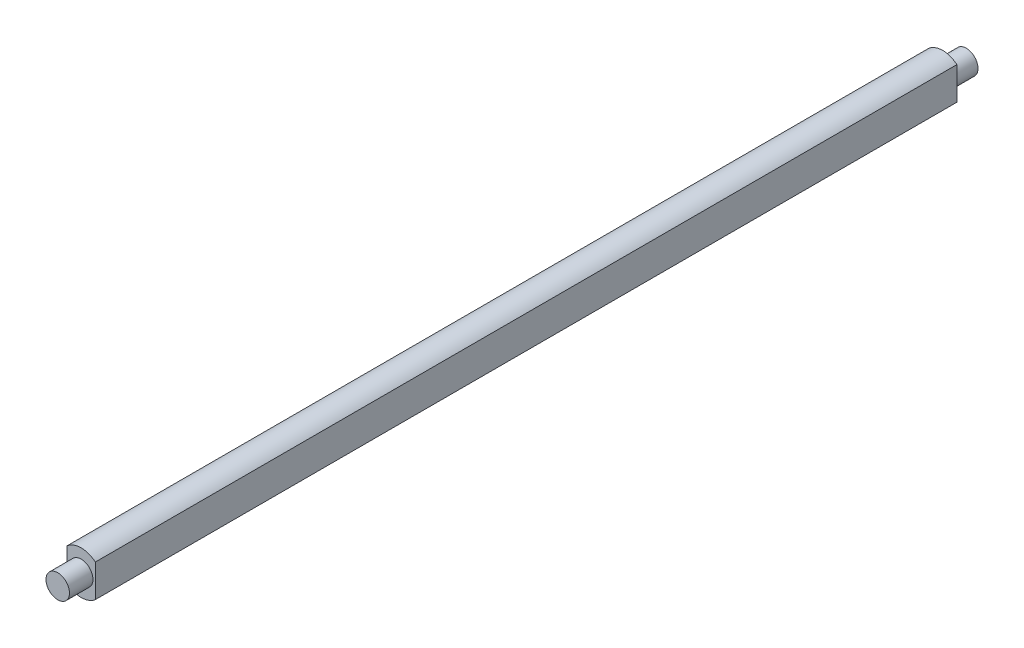
ISO-10303-21;
HEADER;
FILE_DESCRIPTION(('STEP AP214'),'2;1');
FILE_NAME('part.step','',(''),(''),'','','');
FILE_SCHEMA(('AUTOMOTIVE_DESIGN { 1 0 10303 214 1 1 1 1 }'));
ENDSEC;
DATA;
#1=APPLICATION_CONTEXT('core data for automotive mechanical design processes');
#2=APPLICATION_PROTOCOL_DEFINITION('international standard','automotive_design',2000,#1);
#3=PRODUCT_CONTEXT('',#1,'mechanical');
#4=PRODUCT('Part','Part','',(#3));
#5=PRODUCT_RELATED_PRODUCT_CATEGORY('part','',(#4));
#6=PRODUCT_DEFINITION_FORMATION('','',#4);
#7=PRODUCT_DEFINITION_CONTEXT('part definition',#1,'design');
#8=PRODUCT_DEFINITION('design','',#6,#7);
#9=PRODUCT_DEFINITION_SHAPE('','',#8);
#10=(LENGTH_UNIT() NAMED_UNIT(*) SI_UNIT(.MILLI.,.METRE.));
#11=(NAMED_UNIT(*) PLANE_ANGLE_UNIT() SI_UNIT($,.RADIAN.));
#12=(NAMED_UNIT(*) SI_UNIT($,.STERADIAN.) SOLID_ANGLE_UNIT());
#13=UNCERTAINTY_MEASURE_WITH_UNIT(LENGTH_MEASURE(1.E-05),#10,'distance_accuracy_value','');
#14=(GEOMETRIC_REPRESENTATION_CONTEXT(3) GLOBAL_UNCERTAINTY_ASSIGNED_CONTEXT((#13)) GLOBAL_UNIT_ASSIGNED_CONTEXT((#10,
#11,#12)) REPRESENTATION_CONTEXT('',''));
#15=CARTESIAN_POINT('',(0.,0.,0.));
#16=DIRECTION('',(0.,0.,1.));
#17=DIRECTION('',(1.,0.,0.));
#18=AXIS2_PLACEMENT_3D('',#15,#16,#17);
#19=CARTESIAN_POINT('',(1.79891634046723,0.,110.));
#20=DIRECTION('',(1.,0.,0.));
#21=DIRECTION('',(0.,0.,-1.));
#22=AXIS2_PLACEMENT_3D('',#19,#20,#21);
#23=PLANE('',#22);
#24=DIRECTION('',(0.,-1.,0.));
#25=VECTOR('',#24,1.);
#26=CARTESIAN_POINT('',(1.79891634046723,0.,0.));
#27=LINE('',#26,#25);
#28=CARTESIAN_POINT('',(1.79891634046723,2.08,0.));
#29=VERTEX_POINT('',#28);
#30=CARTESIAN_POINT('',(1.79891634046723,-2.08,0.));
#31=VERTEX_POINT('',#30);
#32=EDGE_CURVE('E115',#29,#31,#27,.T.);
#33=ORIENTED_EDGE('',*,*,#32,.F.);
#34=DIRECTION('',(0.,0.,-1.));
#35=VECTOR('',#34,1.);
#36=CARTESIAN_POINT('',(1.79891634046723,2.08,110.));
#37=LINE('',#36,#35);
#38=CARTESIAN_POINT('',(1.79891634046723,2.08,110.));
#39=VERTEX_POINT('',#38);
#40=EDGE_CURVE('E48',#39,#29,#37,.T.);
#41=ORIENTED_EDGE('',*,*,#40,.F.);
#42=DIRECTION('',(0.,-1.,0.));
#43=VECTOR('',#42,1.);
#44=CARTESIAN_POINT('',(1.79891634046723,0.,110.));
#45=LINE('',#44,#43);
#46=CARTESIAN_POINT('',(1.79891634046723,-2.08,110.));
#47=VERTEX_POINT('',#46);
#48=EDGE_CURVE('E99',#39,#47,#45,.T.);
#49=ORIENTED_EDGE('',*,*,#48,.T.);
#50=DIRECTION('',(0.,0.,-1.));
#51=VECTOR('',#50,1.);
#52=CARTESIAN_POINT('',(1.79891634046723,-2.08,110.));
#53=LINE('',#52,#51);
#54=EDGE_CURVE('E88',#47,#31,#53,.T.);
#55=ORIENTED_EDGE('',*,*,#54,.T.);
#56=EDGE_LOOP('',(#33,#41,#49,#55));
#57=FACE_BOUND('',#56,.T.);
#58=ADVANCED_FACE('F45',(#57),#23,.T.);
#59=CARTESIAN_POINT('',(0.,0.,110.));
#60=DIRECTION('',(0.,0.,-1.));
#61=DIRECTION('',(-1.,0.,0.));
#62=AXIS2_PLACEMENT_3D('',#59,#60,#61);
#63=CYLINDRICAL_SURFACE('',#62,2.75);
#64=CARTESIAN_POINT('',(0.,0.,0.));
#65=DIRECTION('',(0.,0.,1.));
#66=DIRECTION('',(1.,0.,0.));
#67=AXIS2_PLACEMENT_3D('',#64,#65,#66);
#68=CIRCLE('',#67,2.75);
#69=CARTESIAN_POINT('',(-1.79891634046723,2.08,0.));
#70=VERTEX_POINT('',#69);
#71=EDGE_CURVE('E106',#29,#70,#68,.T.);
#72=ORIENTED_EDGE('',*,*,#71,.T.);
#73=DIRECTION('',(0.,0.,-1.));
#74=VECTOR('',#73,1.);
#75=CARTESIAN_POINT('',(-1.79891634046723,2.08,110.));
#76=LINE('',#75,#74);
#77=CARTESIAN_POINT('',(-1.79891634046723,2.08,110.));
#78=VERTEX_POINT('',#77);
#79=EDGE_CURVE('E103',#78,#70,#76,.T.);
#80=ORIENTED_EDGE('',*,*,#79,.F.);
#81=CARTESIAN_POINT('',(0.,0.,110.));
#82=DIRECTION('',(0.,0.,1.));
#83=DIRECTION('',(1.,0.,0.));
#84=AXIS2_PLACEMENT_3D('',#81,#82,#83);
#85=CIRCLE('',#84,2.75);
#86=EDGE_CURVE('E94',#39,#78,#85,.T.);
#87=ORIENTED_EDGE('',*,*,#86,.F.);
#88=ORIENTED_EDGE('',*,*,#40,.T.);
#89=EDGE_LOOP('',(#72,#80,#87,#88));
#90=FACE_BOUND('',#89,.T.);
#91=ADVANCED_FACE('F104',(#90),#63,.T.);
#92=CARTESIAN_POINT('',(-1.79891634046723,0.,110.));
#93=DIRECTION('',(1.,0.,0.));
#94=DIRECTION('',(0.,0.,-1.));
#95=AXIS2_PLACEMENT_3D('',#92,#93,#94);
#96=PLANE('',#95);
#97=DIRECTION('',(0.,-1.,0.));
#98=VECTOR('',#97,1.);
#99=CARTESIAN_POINT('',(-1.79891634046723,0.,0.));
#100=LINE('',#99,#98);
#101=CARTESIAN_POINT('',(-1.79891634046723,-2.08,0.));
#102=VERTEX_POINT('',#101);
#103=EDGE_CURVE('E81',#70,#102,#100,.T.);
#104=ORIENTED_EDGE('',*,*,#103,.T.);
#105=DIRECTION('',(0.,0.,-1.));
#106=VECTOR('',#105,1.);
#107=CARTESIAN_POINT('',(-1.79891634046723,-2.08,110.));
#108=LINE('',#107,#106);
#109=CARTESIAN_POINT('',(-1.79891634046723,-2.08,110.));
#110=VERTEX_POINT('',#109);
#111=EDGE_CURVE('E108',#110,#102,#108,.T.);
#112=ORIENTED_EDGE('',*,*,#111,.F.);
#113=DIRECTION('',(0.,-1.,0.));
#114=VECTOR('',#113,1.);
#115=CARTESIAN_POINT('',(-1.79891634046723,0.,110.));
#116=LINE('',#115,#114);
#117=EDGE_CURVE('E98',#78,#110,#116,.T.);
#118=ORIENTED_EDGE('',*,*,#117,.F.);
#119=ORIENTED_EDGE('',*,*,#79,.T.);
#120=EDGE_LOOP('',(#104,#112,#118,#119));
#121=FACE_BOUND('',#120,.T.);
#122=ADVANCED_FACE('F109',(#121),#96,.F.);
#123=EDGE_CURVE('E122',#102,#31,#68,.T.);
#124=ORIENTED_EDGE('',*,*,#123,.T.);
#125=ORIENTED_EDGE('',*,*,#54,.F.);
#126=EDGE_CURVE('E64',#110,#47,#85,.T.);
#127=ORIENTED_EDGE('',*,*,#126,.F.);
#128=ORIENTED_EDGE('',*,*,#111,.T.);
#129=EDGE_LOOP('',(#124,#125,#127,#128));
#130=FACE_BOUND('',#129,.T.);
#131=ADVANCED_FACE('F130',(#130),#63,.T.);
#132=CARTESIAN_POINT('',(0.,0.,110.));
#133=DIRECTION('',(0.,0.,1.));
#134=DIRECTION('',(1.,0.,0.));
#135=AXIS2_PLACEMENT_3D('',#132,#133,#134);
#136=PLANE('',#135);
#137=CARTESIAN_POINT('',(0.,0.,110.));
#138=DIRECTION('',(0.,0.,1.));
#139=DIRECTION('',(1.,0.,0.));
#140=AXIS2_PLACEMENT_3D('',#137,#138,#139);
#141=CIRCLE('',#140,1.5);
#142=CARTESIAN_POINT('',(1.5,0.,110.));
#143=VERTEX_POINT('',#142);
#144=EDGE_CURVE('E55',#143,#143,#141,.T.);
#145=ORIENTED_EDGE('',*,*,#144,.F.);
#146=EDGE_LOOP('',(#145));
#147=FACE_BOUND('',#146,.T.);
#148=ORIENTED_EDGE('',*,*,#48,.F.);
#149=ORIENTED_EDGE('',*,*,#86,.T.);
#150=ORIENTED_EDGE('',*,*,#117,.T.);
#151=ORIENTED_EDGE('',*,*,#126,.T.);
#152=EDGE_LOOP('',(#148,#149,#150,#151));
#153=FACE_BOUND('',#152,.T.);
#154=ADVANCED_FACE('F96',(#147,#153),#136,.T.);
#155=CARTESIAN_POINT('',(0.,0.,0.));
#156=DIRECTION('',(0.,0.,1.));
#157=DIRECTION('',(1.,0.,0.));
#158=AXIS2_PLACEMENT_3D('',#155,#156,#157);
#159=PLANE('',#158);
#160=CARTESIAN_POINT('',(0.,0.,0.));
#161=DIRECTION('',(0.,0.,-1.));
#162=DIRECTION('',(-1.,0.,0.));
#163=AXIS2_PLACEMENT_3D('',#160,#161,#162);
#164=CIRCLE('',#163,1.5);
#165=CARTESIAN_POINT('',(-1.5,0.,0.));
#166=VERTEX_POINT('',#165);
#167=EDGE_CURVE('E11',#166,#166,#164,.T.);
#168=ORIENTED_EDGE('',*,*,#167,.F.);
#169=EDGE_LOOP('',(#168));
#170=FACE_BOUND('',#169,.T.);
#171=ORIENTED_EDGE('',*,*,#32,.T.);
#172=ORIENTED_EDGE('',*,*,#123,.F.);
#173=ORIENTED_EDGE('',*,*,#103,.F.);
#174=ORIENTED_EDGE('',*,*,#71,.F.);
#175=EDGE_LOOP('',(#171,#172,#173,#174));
#176=FACE_BOUND('',#175,.T.);
#177=ADVANCED_FACE('F132',(#170,#176),#159,.F.);
#178=CARTESIAN_POINT('',(0.,0.,113.));
#179=DIRECTION('',(0.,0.,-1.));
#180=DIRECTION('',(-1.,0.,0.));
#181=AXIS2_PLACEMENT_3D('',#178,#179,#180);
#182=CYLINDRICAL_SURFACE('',#181,1.5);
#183=CARTESIAN_POINT('',(0.,0.,113.));
#184=DIRECTION('',(0.,0.,1.));
#185=DIRECTION('',(1.,0.,0.));
#186=AXIS2_PLACEMENT_3D('',#183,#184,#185);
#187=CIRCLE('',#186,1.5);
#188=CARTESIAN_POINT('',(1.5,0.,113.));
#189=VERTEX_POINT('',#188);
#190=EDGE_CURVE('E119',#189,#189,#187,.T.);
#191=ORIENTED_EDGE('',*,*,#190,.F.);
#192=EDGE_LOOP('',(#191));
#193=FACE_BOUND('',#192,.T.);
#194=ORIENTED_EDGE('',*,*,#144,.T.);
#195=EDGE_LOOP('',(#194));
#196=FACE_BOUND('',#195,.T.);
#197=ADVANCED_FACE('F157',(#193,#196),#182,.T.);
#198=CARTESIAN_POINT('',(0.,0.,113.));
#199=DIRECTION('',(0.,0.,1.));
#200=DIRECTION('',(1.,0.,0.));
#201=AXIS2_PLACEMENT_3D('',#198,#199,#200);
#202=PLANE('',#201);
#203=ORIENTED_EDGE('',*,*,#190,.T.);
#204=EDGE_LOOP('',(#203));
#205=FACE_BOUND('',#204,.T.);
#206=ADVANCED_FACE('F152',(#205),#202,.T.);
#207=CARTESIAN_POINT('',(0.,0.,-3.));
#208=DIRECTION('',(0.,0.,1.));
#209=DIRECTION('',(1.,0.,0.));
#210=AXIS2_PLACEMENT_3D('',#207,#208,#209);
#211=CYLINDRICAL_SURFACE('',#210,1.5);
#212=CARTESIAN_POINT('',(0.,0.,-3.));
#213=DIRECTION('',(0.,0.,-1.));
#214=DIRECTION('',(-1.,0.,0.));
#215=AXIS2_PLACEMENT_3D('',#212,#213,#214);
#216=CIRCLE('',#215,1.5);
#217=CARTESIAN_POINT('',(-1.5,0.,-3.));
#218=VERTEX_POINT('',#217);
#219=EDGE_CURVE('E141',#218,#218,#216,.T.);
#220=ORIENTED_EDGE('',*,*,#219,.F.);
#221=EDGE_LOOP('',(#220));
#222=FACE_BOUND('',#221,.T.);
#223=ORIENTED_EDGE('',*,*,#167,.T.);
#224=EDGE_LOOP('',(#223));
#225=FACE_BOUND('',#224,.T.);
#226=ADVANCED_FACE('F149',(#222,#225),#211,.T.);
#227=CARTESIAN_POINT('',(0.,0.,-3.));
#228=DIRECTION('',(0.,0.,-1.));
#229=DIRECTION('',(-1.,0.,0.));
#230=AXIS2_PLACEMENT_3D('',#227,#228,#229);
#231=PLANE('',#230);
#232=ORIENTED_EDGE('',*,*,#219,.T.);
#233=EDGE_LOOP('',(#232));
#234=FACE_BOUND('',#233,.T.);
#235=ADVANCED_FACE('F147',(#234),#231,.T.);
#236=CLOSED_SHELL('',(#58,#91,#122,#131,#154,#177,#197,#206,#226,#235));
#237=MANIFOLD_SOLID_BREP('B2',#236);
#238=ADVANCED_BREP_SHAPE_REPRESENTATION('',(#18,#237),#14);
#239=SHAPE_DEFINITION_REPRESENTATION(#9,#238);
ENDSEC;
END-ISO-10303-21;
